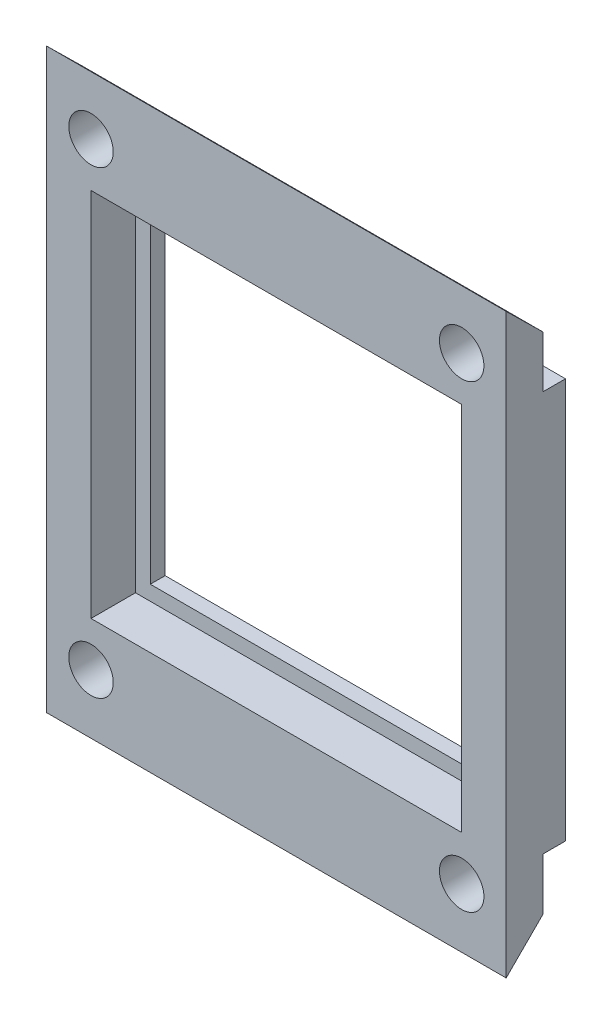
ISO-10303-21;
HEADER;
FILE_DESCRIPTION(('STEP AP214'),'2;1');
FILE_NAME('part.step','',(''),(''),'','','');
FILE_SCHEMA(('AUTOMOTIVE_DESIGN { 1 0 10303 214 1 1 1 1 }'));
ENDSEC;
DATA;
#1=APPLICATION_CONTEXT('core data for automotive mechanical design processes');
#2=APPLICATION_PROTOCOL_DEFINITION('international standard','automotive_design',2000,#1);
#3=PRODUCT_CONTEXT('',#1,'mechanical');
#4=PRODUCT('Part','Part','',(#3));
#5=PRODUCT_RELATED_PRODUCT_CATEGORY('part','',(#4));
#6=PRODUCT_DEFINITION_FORMATION('','',#4);
#7=PRODUCT_DEFINITION_CONTEXT('part definition',#1,'design');
#8=PRODUCT_DEFINITION('design','',#6,#7);
#9=PRODUCT_DEFINITION_SHAPE('','',#8);
#10=(LENGTH_UNIT() NAMED_UNIT(*) SI_UNIT(.MILLI.,.METRE.));
#11=(NAMED_UNIT(*) PLANE_ANGLE_UNIT() SI_UNIT($,.RADIAN.));
#12=(NAMED_UNIT(*) SI_UNIT($,.STERADIAN.) SOLID_ANGLE_UNIT());
#13=UNCERTAINTY_MEASURE_WITH_UNIT(LENGTH_MEASURE(1.E-05),#10,'distance_accuracy_value','');
#14=(GEOMETRIC_REPRESENTATION_CONTEXT(3) GLOBAL_UNCERTAINTY_ASSIGNED_CONTEXT((#13)) GLOBAL_UNIT_ASSIGNED_CONTEXT((#10,
#11,#12)) REPRESENTATION_CONTEXT('',''));
#15=CARTESIAN_POINT('',(0.,0.,0.));
#16=DIRECTION('',(0.,0.,1.));
#17=DIRECTION('',(1.,0.,0.));
#18=AXIS2_PLACEMENT_3D('',#15,#16,#17);
#19=CARTESIAN_POINT('',(15.5,15.5,0.));
#20=DIRECTION('',(0.,0.712755150375511,-0.701412928033966));
#21=DIRECTION('',(0.,0.701412928033966,0.712755150375511));
#22=AXIS2_PLACEMENT_3D('',#19,#20,#21);
#23=PLANE('',#22);
#24=DIRECTION('',(0.,-0.701412928033966,-0.712755150375511));
#25=VECTOR('',#24,1.);
#26=CARTESIAN_POINT('',(15.5,15.5,0.));
#27=LINE('',#26,#25);
#28=CARTESIAN_POINT('',(15.5,19.4363471602523,4.));
#29=VERTEX_POINT('',#28);
#30=CARTESIAN_POINT('',(15.5,17.,1.52425580258409));
#31=VERTEX_POINT('',#30);
#32=EDGE_CURVE('E242',#29,#31,#27,.T.);
#33=ORIENTED_EDGE('',*,*,#32,.T.);
#34=DIRECTION('',(-1.,0.,0.));
#35=VECTOR('',#34,1.);
#36=CARTESIAN_POINT('',(15.5,17.,1.52425580258409));
#37=LINE('',#36,#35);
#38=CARTESIAN_POINT('',(12.5,17.,1.52425580258409));
#39=VERTEX_POINT('',#38);
#40=EDGE_CURVE('E218',#31,#39,#37,.T.);
#41=ORIENTED_EDGE('',*,*,#40,.T.);
#42=CARTESIAN_POINT('',(-12.5,17.,1.52425580258409));
#43=VERTEX_POINT('',#42);
#44=EDGE_CURVE('E221',#39,#43,#37,.T.);
#45=ORIENTED_EDGE('',*,*,#44,.T.);
#46=CARTESIAN_POINT('',(-15.5,17.,1.52425580258409));
#47=VERTEX_POINT('',#46);
#48=EDGE_CURVE('E222',#43,#47,#37,.T.);
#49=ORIENTED_EDGE('',*,*,#48,.T.);
#50=DIRECTION('',(0.,-0.701412928033966,-0.712755150375511));
#51=VECTOR('',#50,1.);
#52=CARTESIAN_POINT('',(-15.5,15.5,0.));
#53=LINE('',#52,#51);
#54=CARTESIAN_POINT('',(-15.5,19.4363471602523,4.));
#55=VERTEX_POINT('',#54);
#56=EDGE_CURVE('E246',#55,#47,#53,.T.);
#57=ORIENTED_EDGE('',*,*,#56,.F.);
#58=DIRECTION('',(-1.,0.,0.));
#59=VECTOR('',#58,1.);
#60=CARTESIAN_POINT('',(15.5,19.4363471602523,4.));
#61=LINE('',#60,#59);
#62=EDGE_CURVE('E245',#29,#55,#61,.T.);
#63=ORIENTED_EDGE('',*,*,#62,.F.);
#64=EDGE_LOOP('',(#33,#41,#45,#49,#57,#63));
#65=FACE_BOUND('',#64,.T.);
#66=ADVANCED_FACE('F42',(#65),#23,.T.);
#67=CARTESIAN_POINT('',(15.5,-15.5,4.));
#68=DIRECTION('',(-1.,0.,0.));
#69=DIRECTION('',(0.,0.,1.));
#70=AXIS2_PLACEMENT_3D('',#67,#68,#69);
#71=PLANE('',#70);
#72=DIRECTION('',(0.,-0.707106781186549,0.707106781186546));
#73=VECTOR('',#72,1.);
#74=CARTESIAN_POINT('',(15.5,-19.5,4.));
#75=LINE('',#74,#73);
#76=CARTESIAN_POINT('',(15.5,-17.,1.5));
#77=VERTEX_POINT('',#76);
#78=CARTESIAN_POINT('',(15.5,-19.5,4.));
#79=VERTEX_POINT('',#78);
#80=EDGE_CURVE('E193',#77,#79,#75,.T.);
#81=ORIENTED_EDGE('',*,*,#80,.F.);
#82=DIRECTION('',(0.,1.,0.));
#83=VECTOR('',#82,1.);
#84=CARTESIAN_POINT('',(15.5,0.,1.5));
#85=LINE('',#84,#83);
#86=CARTESIAN_POINT('',(15.5,-13.5,1.5));
#87=VERTEX_POINT('',#86);
#88=EDGE_CURVE('E177',#77,#87,#85,.T.);
#89=ORIENTED_EDGE('',*,*,#88,.T.);
#90=DIRECTION('',(0.,0.,-1.));
#91=VECTOR('',#90,1.);
#92=CARTESIAN_POINT('',(15.5,-13.5,0.));
#93=LINE('',#92,#91);
#94=CARTESIAN_POINT('',(15.5,-13.5,0.));
#95=VERTEX_POINT('',#94);
#96=EDGE_CURVE('E183',#87,#95,#93,.T.);
#97=ORIENTED_EDGE('',*,*,#96,.T.);
#98=DIRECTION('',(0.,1.,0.));
#99=VECTOR('',#98,1.);
#100=CARTESIAN_POINT('',(15.5,-15.5,0.));
#101=LINE('',#100,#99);
#102=CARTESIAN_POINT('',(15.5,13.5,0.));
#103=VERTEX_POINT('',#102);
#104=EDGE_CURVE('E309',#95,#103,#101,.T.);
#105=ORIENTED_EDGE('',*,*,#104,.T.);
#106=DIRECTION('',(0.,0.,-1.));
#107=VECTOR('',#106,1.);
#108=CARTESIAN_POINT('',(15.5,13.5,0.));
#109=LINE('',#108,#107);
#110=CARTESIAN_POINT('',(15.5,13.5,1.52425580258409));
#111=VERTEX_POINT('',#110);
#112=EDGE_CURVE('E57',#111,#103,#109,.T.);
#113=ORIENTED_EDGE('',*,*,#112,.F.);
#114=DIRECTION('',(0.,-1.,0.));
#115=VECTOR('',#114,1.);
#116=CARTESIAN_POINT('',(15.5,0.,1.52425580258409));
#117=LINE('',#116,#115);
#118=EDGE_CURVE('E208',#31,#111,#117,.T.);
#119=ORIENTED_EDGE('',*,*,#118,.F.);
#120=ORIENTED_EDGE('',*,*,#32,.F.);
#121=DIRECTION('',(0.,1.,0.));
#122=VECTOR('',#121,1.);
#123=CARTESIAN_POINT('',(15.5,-15.5,4.));
#124=LINE('',#123,#122);
#125=EDGE_CURVE('E317',#79,#29,#124,.T.);
#126=ORIENTED_EDGE('',*,*,#125,.F.);
#127=EDGE_LOOP('',(#81,#89,#97,#105,#113,#119,#120,#126));
#128=FACE_BOUND('',#127,.T.);
#129=ADVANCED_FACE('F44',(#128),#71,.F.);
#130=CARTESIAN_POINT('',(-15.5,-15.5,4.));
#131=DIRECTION('',(1.,0.,0.));
#132=DIRECTION('',(0.,0.,-1.));
#133=AXIS2_PLACEMENT_3D('',#130,#131,#132);
#134=PLANE('',#133);
#135=DIRECTION('',(0.,0.,-1.));
#136=VECTOR('',#135,1.);
#137=CARTESIAN_POINT('',(-15.5,-13.5,0.));
#138=LINE('',#137,#136);
#139=CARTESIAN_POINT('',(-15.5,-13.5,1.5));
#140=VERTEX_POINT('',#139);
#141=CARTESIAN_POINT('',(-15.5,-13.5,0.));
#142=VERTEX_POINT('',#141);
#143=EDGE_CURVE('E67',#140,#142,#138,.T.);
#144=ORIENTED_EDGE('',*,*,#143,.F.);
#145=DIRECTION('',(0.,1.,0.));
#146=VECTOR('',#145,1.);
#147=CARTESIAN_POINT('',(-15.5,0.,1.5));
#148=LINE('',#147,#146);
#149=CARTESIAN_POINT('',(-15.5,-17.,1.5));
#150=VERTEX_POINT('',#149);
#151=EDGE_CURVE('E180',#150,#140,#148,.T.);
#152=ORIENTED_EDGE('',*,*,#151,.F.);
#153=DIRECTION('',(0.,-0.707106781186549,0.707106781186546));
#154=VECTOR('',#153,1.);
#155=CARTESIAN_POINT('',(-15.5,-19.5,4.));
#156=LINE('',#155,#154);
#157=CARTESIAN_POINT('',(-15.5,-19.5,4.));
#158=VERTEX_POINT('',#157);
#159=EDGE_CURVE('E249',#150,#158,#156,.T.);
#160=ORIENTED_EDGE('',*,*,#159,.T.);
#161=DIRECTION('',(0.,-1.,0.));
#162=VECTOR('',#161,1.);
#163=CARTESIAN_POINT('',(-15.5,-15.5,4.));
#164=LINE('',#163,#162);
#165=EDGE_CURVE('E319',#55,#158,#164,.T.);
#166=ORIENTED_EDGE('',*,*,#165,.F.);
#167=ORIENTED_EDGE('',*,*,#56,.T.);
#168=DIRECTION('',(0.,-1.,0.));
#169=VECTOR('',#168,1.);
#170=CARTESIAN_POINT('',(-15.5,0.,1.52425580258409));
#171=LINE('',#170,#169);
#172=CARTESIAN_POINT('',(-15.5,13.5,1.52425580258409));
#173=VERTEX_POINT('',#172);
#174=EDGE_CURVE('E209',#47,#173,#171,.T.);
#175=ORIENTED_EDGE('',*,*,#174,.T.);
#176=DIRECTION('',(0.,0.,-1.));
#177=VECTOR('',#176,1.);
#178=CARTESIAN_POINT('',(-15.5,13.5,0.));
#179=LINE('',#178,#177);
#180=CARTESIAN_POINT('',(-15.5,13.5,0.));
#181=VERTEX_POINT('',#180);
#182=EDGE_CURVE('E212',#173,#181,#179,.T.);
#183=ORIENTED_EDGE('',*,*,#182,.T.);
#184=DIRECTION('',(0.,-1.,0.));
#185=VECTOR('',#184,1.);
#186=CARTESIAN_POINT('',(-15.5,-15.5,0.));
#187=LINE('',#186,#185);
#188=EDGE_CURVE('E320',#181,#142,#187,.T.);
#189=ORIENTED_EDGE('',*,*,#188,.T.);
#190=EDGE_LOOP('',(#144,#152,#160,#166,#167,#175,#183,#189));
#191=FACE_BOUND('',#190,.T.);
#192=ADVANCED_FACE('F350',(#191),#134,.F.);
#193=CARTESIAN_POINT('',(0.,0.,0.));
#194=DIRECTION('',(0.,0.,-1.));
#195=DIRECTION('',(-1.,0.,0.));
#196=AXIS2_PLACEMENT_3D('',#193,#194,#195);
#197=PLANE('',#196);
#198=DIRECTION('',(-1.,0.,0.));
#199=VECTOR('',#198,1.);
#200=CARTESIAN_POINT('',(15.5,-13.5,0.));
#201=LINE('',#200,#199);
#202=EDGE_CURVE('E182',#95,#142,#201,.T.);
#203=ORIENTED_EDGE('',*,*,#202,.T.);
#204=ORIENTED_EDGE('',*,*,#188,.F.);
#205=DIRECTION('',(-1.,0.,0.));
#206=VECTOR('',#205,1.);
#207=CARTESIAN_POINT('',(15.5,13.5,0.));
#208=LINE('',#207,#206);
#209=EDGE_CURVE('E198',#103,#181,#208,.T.);
#210=ORIENTED_EDGE('',*,*,#209,.F.);
#211=ORIENTED_EDGE('',*,*,#104,.F.);
#212=EDGE_LOOP('',(#203,#204,#210,#211));
#213=FACE_BOUND('',#212,.T.);
#214=DIRECTION('',(0.,-1.,0.));
#215=VECTOR('',#214,1.);
#216=CARTESIAN_POINT('',(11.5,0.,0.));
#217=LINE('',#216,#215);
#218=CARTESIAN_POINT('',(11.5,11.5,0.));
#219=VERTEX_POINT('',#218);
#220=CARTESIAN_POINT('',(11.5,-11.5,0.));
#221=VERTEX_POINT('',#220);
#222=EDGE_CURVE('E336',#219,#221,#217,.T.);
#223=ORIENTED_EDGE('',*,*,#222,.F.);
#224=DIRECTION('',(1.,0.,0.));
#225=VECTOR('',#224,1.);
#226=CARTESIAN_POINT('',(0.,11.5,0.));
#227=LINE('',#226,#225);
#228=CARTESIAN_POINT('',(-11.5,11.5,0.));
#229=VERTEX_POINT('',#228);
#230=EDGE_CURVE('E323',#229,#219,#227,.T.);
#231=ORIENTED_EDGE('',*,*,#230,.F.);
#232=DIRECTION('',(0.,1.,0.));
#233=VECTOR('',#232,1.);
#234=CARTESIAN_POINT('',(-11.5,0.,0.));
#235=LINE('',#234,#233);
#236=CARTESIAN_POINT('',(-11.5,-11.5,0.));
#237=VERTEX_POINT('',#236);
#238=EDGE_CURVE('E329',#237,#229,#235,.T.);
#239=ORIENTED_EDGE('',*,*,#238,.F.);
#240=DIRECTION('',(-1.,0.,0.));
#241=VECTOR('',#240,1.);
#242=CARTESIAN_POINT('',(0.,-11.5,0.));
#243=LINE('',#242,#241);
#244=EDGE_CURVE('E333',#221,#237,#243,.T.);
#245=ORIENTED_EDGE('',*,*,#244,.F.);
#246=EDGE_LOOP('',(#223,#231,#239,#245));
#247=FACE_BOUND('',#246,.T.);
#248=ADVANCED_FACE('F376',(#213,#247),#197,.T.);
#249=CARTESIAN_POINT('',(12.5,15.5,10.));
#250=DIRECTION('',(0.,0.,-1.));
#251=DIRECTION('',(-1.,0.,0.));
#252=AXIS2_PLACEMENT_3D('',#249,#250,#251);
#253=CYLINDRICAL_SURFACE('',#252,1.5);
#254=CARTESIAN_POINT('',(12.5,15.5,4.));
#255=DIRECTION('',(0.,0.,-1.));
#256=DIRECTION('',(-1.,0.,0.));
#257=AXIS2_PLACEMENT_3D('',#254,#255,#256);
#258=CIRCLE('',#257,1.5);
#259=CARTESIAN_POINT('',(11.,15.5,4.));
#260=VERTEX_POINT('',#259);
#261=EDGE_CURVE('E239',#260,#260,#258,.T.);
#262=ORIENTED_EDGE('',*,*,#261,.F.);
#263=EDGE_LOOP('',(#262));
#264=FACE_BOUND('',#263,.T.);
#265=CARTESIAN_POINT('',(12.5,15.5,1.52425580258409));
#266=DIRECTION('',(0.,0.,-1.));
#267=DIRECTION('',(0.,1.,0.));
#268=AXIS2_PLACEMENT_3D('',#265,#266,#267);
#269=CIRCLE('',#268,1.5);
#270=EDGE_CURVE('E227',#39,#39,#269,.F.);
#271=ORIENTED_EDGE('',*,*,#270,.F.);
#272=EDGE_LOOP('',(#271));
#273=FACE_BOUND('',#272,.T.);
#274=ADVANCED_FACE('F367',(#264,#273),#253,.F.);
#275=CARTESIAN_POINT('',(-12.5,15.5,10.));
#276=DIRECTION('',(0.,0.,-1.));
#277=DIRECTION('',(-1.,0.,0.));
#278=AXIS2_PLACEMENT_3D('',#275,#276,#277);
#279=CYLINDRICAL_SURFACE('',#278,1.5);
#280=CARTESIAN_POINT('',(-12.5,15.5,4.));
#281=DIRECTION('',(0.,0.,-1.));
#282=DIRECTION('',(-1.,0.,0.));
#283=AXIS2_PLACEMENT_3D('',#280,#281,#282);
#284=CIRCLE('',#283,1.5);
#285=CARTESIAN_POINT('',(-14.,15.5,4.));
#286=VERTEX_POINT('',#285);
#287=EDGE_CURVE('E236',#286,#286,#284,.F.);
#288=ORIENTED_EDGE('',*,*,#287,.T.);
#289=EDGE_LOOP('',(#288));
#290=FACE_BOUND('',#289,.T.);
#291=CARTESIAN_POINT('',(-12.5,15.5,1.52425580258409));
#292=DIRECTION('',(0.,0.,-1.));
#293=DIRECTION('',(0.,1.,0.));
#294=AXIS2_PLACEMENT_3D('',#291,#292,#293);
#295=CIRCLE('',#294,1.5);
#296=EDGE_CURVE('E11',#43,#43,#295,.T.);
#297=ORIENTED_EDGE('',*,*,#296,.T.);
#298=EDGE_LOOP('',(#297));
#299=FACE_BOUND('',#298,.T.);
#300=ADVANCED_FACE('F365',(#290,#299),#279,.F.);
#301=CARTESIAN_POINT('',(-15.5,-19.5,4.));
#302=DIRECTION('',(0.,0.707106781186546,0.707106781186549));
#303=DIRECTION('',(0.,-0.707106781186549,0.707106781186546));
#304=AXIS2_PLACEMENT_3D('',#301,#302,#303);
#305=PLANE('',#304);
#306=ORIENTED_EDGE('',*,*,#159,.F.);
#307=DIRECTION('',(-1.,0.,0.));
#308=VECTOR('',#307,1.);
#309=CARTESIAN_POINT('',(15.5,-17.,1.5));
#310=LINE('',#309,#308);
#311=CARTESIAN_POINT('',(-12.5,-17.,1.49999999999999));
#312=VERTEX_POINT('',#311);
#313=EDGE_CURVE('E204',#312,#150,#310,.T.);
#314=ORIENTED_EDGE('',*,*,#313,.F.);
#315=CARTESIAN_POINT('',(12.5,-17.,1.49999999999999));
#316=VERTEX_POINT('',#315);
#317=EDGE_CURVE('E203',#316,#312,#310,.T.);
#318=ORIENTED_EDGE('',*,*,#317,.F.);
#319=EDGE_CURVE('E200',#77,#316,#310,.T.);
#320=ORIENTED_EDGE('',*,*,#319,.F.);
#321=ORIENTED_EDGE('',*,*,#80,.T.);
#322=DIRECTION('',(1.,0.,0.));
#323=VECTOR('',#322,1.);
#324=CARTESIAN_POINT('',(-15.5,-19.5,4.));
#325=LINE('',#324,#323);
#326=EDGE_CURVE('E252',#158,#79,#325,.T.);
#327=ORIENTED_EDGE('',*,*,#326,.F.);
#328=EDGE_LOOP('',(#306,#314,#318,#320,#321,#327));
#329=FACE_BOUND('',#328,.T.);
#330=ADVANCED_FACE('F346',(#329),#305,.F.);
#331=CARTESIAN_POINT('',(0.,0.,1.));
#332=DIRECTION('',(0.,0.,-1.));
#333=DIRECTION('',(-1.,0.,0.));
#334=AXIS2_PLACEMENT_3D('',#331,#332,#333);
#335=PLANE('',#334);
#336=DIRECTION('',(0.,1.,0.));
#337=VECTOR('',#336,1.);
#338=CARTESIAN_POINT('',(12.5,-12.5,1.));
#339=LINE('',#338,#337);
#340=CARTESIAN_POINT('',(12.5,-12.5,1.));
#341=VERTEX_POINT('',#340);
#342=CARTESIAN_POINT('',(12.5,12.5,1.));
#343=VERTEX_POINT('',#342);
#344=EDGE_CURVE('E281',#341,#343,#339,.T.);
#345=ORIENTED_EDGE('',*,*,#344,.T.);
#346=DIRECTION('',(-1.,0.,0.));
#347=VECTOR('',#346,1.);
#348=CARTESIAN_POINT('',(-12.5,12.5,1.));
#349=LINE('',#348,#347);
#350=CARTESIAN_POINT('',(-12.5,12.5,1.));
#351=VERTEX_POINT('',#350);
#352=EDGE_CURVE('E284',#343,#351,#349,.T.);
#353=ORIENTED_EDGE('',*,*,#352,.T.);
#354=DIRECTION('',(0.,-1.,0.));
#355=VECTOR('',#354,1.);
#356=CARTESIAN_POINT('',(-12.5,-12.5,1.));
#357=LINE('',#356,#355);
#358=CARTESIAN_POINT('',(-12.5,-12.5,1.));
#359=VERTEX_POINT('',#358);
#360=EDGE_CURVE('E288',#351,#359,#357,.T.);
#361=ORIENTED_EDGE('',*,*,#360,.T.);
#362=DIRECTION('',(1.,0.,0.));
#363=VECTOR('',#362,1.);
#364=CARTESIAN_POINT('',(-12.5,-12.5,1.));
#365=LINE('',#364,#363);
#366=EDGE_CURVE('E292',#359,#341,#365,.T.);
#367=ORIENTED_EDGE('',*,*,#366,.T.);
#368=EDGE_LOOP('',(#345,#353,#361,#367));
#369=FACE_BOUND('',#368,.T.);
#370=DIRECTION('',(0.,1.,0.));
#371=VECTOR('',#370,1.);
#372=CARTESIAN_POINT('',(11.5,-11.5,1.));
#373=LINE('',#372,#371);
#374=CARTESIAN_POINT('',(11.5,-11.5,1.));
#375=VERTEX_POINT('',#374);
#376=CARTESIAN_POINT('',(11.5,11.5,1.));
#377=VERTEX_POINT('',#376);
#378=EDGE_CURVE('E257',#375,#377,#373,.T.);
#379=ORIENTED_EDGE('',*,*,#378,.F.);
#380=DIRECTION('',(1.,0.,0.));
#381=VECTOR('',#380,1.);
#382=CARTESIAN_POINT('',(-11.5,-11.5,1.));
#383=LINE('',#382,#381);
#384=CARTESIAN_POINT('',(-11.5,-11.5,1.));
#385=VERTEX_POINT('',#384);
#386=EDGE_CURVE('E266',#385,#375,#383,.T.);
#387=ORIENTED_EDGE('',*,*,#386,.F.);
#388=DIRECTION('',(0.,-1.,0.));
#389=VECTOR('',#388,1.);
#390=CARTESIAN_POINT('',(-11.5,-11.5,1.));
#391=LINE('',#390,#389);
#392=CARTESIAN_POINT('',(-11.5,11.5,1.));
#393=VERTEX_POINT('',#392);
#394=EDGE_CURVE('E263',#393,#385,#391,.T.);
#395=ORIENTED_EDGE('',*,*,#394,.F.);
#396=DIRECTION('',(-1.,0.,0.));
#397=VECTOR('',#396,1.);
#398=CARTESIAN_POINT('',(-11.5,11.5,1.));
#399=LINE('',#398,#397);
#400=EDGE_CURVE('E260',#377,#393,#399,.T.);
#401=ORIENTED_EDGE('',*,*,#400,.F.);
#402=EDGE_LOOP('',(#379,#387,#395,#401));
#403=FACE_BOUND('',#402,.T.);
#404=ADVANCED_FACE('F374',(#369,#403),#335,.F.);
#405=CARTESIAN_POINT('',(0.,0.,4.));
#406=DIRECTION('',(0.,0.,-1.));
#407=DIRECTION('',(-1.,0.,0.));
#408=AXIS2_PLACEMENT_3D('',#405,#406,#407);
#409=PLANE('',#408);
#410=CARTESIAN_POINT('',(12.5,-15.5,4.));
#411=DIRECTION('',(0.,0.,-1.));
#412=DIRECTION('',(-1.,0.,0.));
#413=AXIS2_PLACEMENT_3D('',#410,#411,#412);
#414=CIRCLE('',#413,1.5);
#415=CARTESIAN_POINT('',(11.,-15.5,4.));
#416=VERTEX_POINT('',#415);
#417=EDGE_CURVE('E229',#416,#416,#414,.F.);
#418=ORIENTED_EDGE('',*,*,#417,.F.);
#419=EDGE_LOOP('',(#418));
#420=FACE_BOUND('',#419,.T.);
#421=CARTESIAN_POINT('',(-12.5,-15.5,4.));
#422=DIRECTION('',(0.,0.,-1.));
#423=DIRECTION('',(-1.,0.,0.));
#424=AXIS2_PLACEMENT_3D('',#421,#422,#423);
#425=CIRCLE('',#424,1.5);
#426=CARTESIAN_POINT('',(-14.,-15.5,4.));
#427=VERTEX_POINT('',#426);
#428=EDGE_CURVE('E232',#427,#427,#425,.T.);
#429=ORIENTED_EDGE('',*,*,#428,.T.);
#430=EDGE_LOOP('',(#429));
#431=FACE_BOUND('',#430,.T.);
#432=ORIENTED_EDGE('',*,*,#287,.F.);
#433=EDGE_LOOP('',(#432));
#434=FACE_BOUND('',#433,.T.);
#435=ORIENTED_EDGE('',*,*,#261,.T.);
#436=EDGE_LOOP('',(#435));
#437=FACE_BOUND('',#436,.T.);
#438=DIRECTION('',(-1.,0.,0.));
#439=VECTOR('',#438,1.);
#440=CARTESIAN_POINT('',(-12.5,12.5,4.));
#441=LINE('',#440,#439);
#442=CARTESIAN_POINT('',(12.5,12.5,4.));
#443=VERTEX_POINT('',#442);
#444=CARTESIAN_POINT('',(-12.5,12.5,4.));
#445=VERTEX_POINT('',#444);
#446=EDGE_CURVE('E298',#443,#445,#441,.T.);
#447=ORIENTED_EDGE('',*,*,#446,.F.);
#448=DIRECTION('',(0.,1.,0.));
#449=VECTOR('',#448,1.);
#450=CARTESIAN_POINT('',(12.5,-12.5,4.));
#451=LINE('',#450,#449);
#452=CARTESIAN_POINT('',(12.5,-12.5,4.));
#453=VERTEX_POINT('',#452);
#454=EDGE_CURVE('E273',#453,#443,#451,.T.);
#455=ORIENTED_EDGE('',*,*,#454,.F.);
#456=DIRECTION('',(1.,0.,0.));
#457=VECTOR('',#456,1.);
#458=CARTESIAN_POINT('',(-12.5,-12.5,4.));
#459=LINE('',#458,#457);
#460=CARTESIAN_POINT('',(-12.5,-12.5,4.));
#461=VERTEX_POINT('',#460);
#462=EDGE_CURVE('E285',#461,#453,#459,.T.);
#463=ORIENTED_EDGE('',*,*,#462,.F.);
#464=DIRECTION('',(0.,-1.,0.));
#465=VECTOR('',#464,1.);
#466=CARTESIAN_POINT('',(-12.5,-12.5,4.));
#467=LINE('',#466,#465);
#468=EDGE_CURVE('E301',#445,#461,#467,.T.);
#469=ORIENTED_EDGE('',*,*,#468,.F.);
#470=EDGE_LOOP('',(#447,#455,#463,#469));
#471=FACE_BOUND('',#470,.T.);
#472=ORIENTED_EDGE('',*,*,#125,.T.);
#473=ORIENTED_EDGE('',*,*,#62,.T.);
#474=ORIENTED_EDGE('',*,*,#165,.T.);
#475=ORIENTED_EDGE('',*,*,#326,.T.);
#476=EDGE_LOOP('',(#472,#473,#474,#475));
#477=FACE_BOUND('',#476,.T.);
#478=ADVANCED_FACE('F353',(#420,#431,#434,#437,#471,#477),#409,.F.);
#479=CARTESIAN_POINT('',(12.5,-12.5,1.));
#480=DIRECTION('',(1.,0.,0.));
#481=DIRECTION('',(0.,0.,-1.));
#482=AXIS2_PLACEMENT_3D('',#479,#480,#481);
#483=PLANE('',#482);
#484=ORIENTED_EDGE('',*,*,#454,.T.);
#485=DIRECTION('',(0.,0.,1.));
#486=VECTOR('',#485,1.);
#487=CARTESIAN_POINT('',(12.5,12.5,1.));
#488=LINE('',#487,#486);
#489=EDGE_CURVE('E296',#343,#443,#488,.T.);
#490=ORIENTED_EDGE('',*,*,#489,.F.);
#491=ORIENTED_EDGE('',*,*,#344,.F.);
#492=DIRECTION('',(0.,0.,1.));
#493=VECTOR('',#492,1.);
#494=CARTESIAN_POINT('',(12.5,-12.5,1.));
#495=LINE('',#494,#493);
#496=EDGE_CURVE('E307',#341,#453,#495,.T.);
#497=ORIENTED_EDGE('',*,*,#496,.T.);
#498=EDGE_LOOP('',(#484,#490,#491,#497));
#499=FACE_BOUND('',#498,.T.);
#500=ADVANCED_FACE('F411',(#499),#483,.F.);
#501=CARTESIAN_POINT('',(-12.5,-12.5,1.));
#502=DIRECTION('',(0.,-1.,0.));
#503=DIRECTION('',(0.,0.,-1.));
#504=AXIS2_PLACEMENT_3D('',#501,#502,#503);
#505=PLANE('',#504);
#506=ORIENTED_EDGE('',*,*,#462,.T.);
#507=ORIENTED_EDGE('',*,*,#496,.F.);
#508=ORIENTED_EDGE('',*,*,#366,.F.);
#509=DIRECTION('',(0.,0.,1.));
#510=VECTOR('',#509,1.);
#511=CARTESIAN_POINT('',(-12.5,-12.5,1.));
#512=LINE('',#511,#510);
#513=EDGE_CURVE('E310',#359,#461,#512,.T.);
#514=ORIENTED_EDGE('',*,*,#513,.T.);
#515=EDGE_LOOP('',(#506,#507,#508,#514));
#516=FACE_BOUND('',#515,.T.);
#517=ADVANCED_FACE('F407',(#516),#505,.F.);
#518=CARTESIAN_POINT('',(-12.5,-12.5,1.));
#519=DIRECTION('',(-1.,0.,0.));
#520=DIRECTION('',(0.,0.,1.));
#521=AXIS2_PLACEMENT_3D('',#518,#519,#520);
#522=PLANE('',#521);
#523=ORIENTED_EDGE('',*,*,#468,.T.);
#524=ORIENTED_EDGE('',*,*,#513,.F.);
#525=ORIENTED_EDGE('',*,*,#360,.F.);
#526=DIRECTION('',(0.,0.,1.));
#527=VECTOR('',#526,1.);
#528=CARTESIAN_POINT('',(-12.5,12.5,1.));
#529=LINE('',#528,#527);
#530=EDGE_CURVE('E313',#351,#445,#529,.T.);
#531=ORIENTED_EDGE('',*,*,#530,.T.);
#532=EDGE_LOOP('',(#523,#524,#525,#531));
#533=FACE_BOUND('',#532,.T.);
#534=ADVANCED_FACE('F410',(#533),#522,.F.);
#535=CARTESIAN_POINT('',(-12.5,12.5,1.));
#536=DIRECTION('',(0.,1.,0.));
#537=DIRECTION('',(0.,0.,1.));
#538=AXIS2_PLACEMENT_3D('',#535,#536,#537);
#539=PLANE('',#538);
#540=ORIENTED_EDGE('',*,*,#446,.T.);
#541=ORIENTED_EDGE('',*,*,#530,.F.);
#542=ORIENTED_EDGE('',*,*,#352,.F.);
#543=ORIENTED_EDGE('',*,*,#489,.T.);
#544=EDGE_LOOP('',(#540,#541,#542,#543));
#545=FACE_BOUND('',#544,.T.);
#546=ADVANCED_FACE('F402',(#545),#539,.F.);
#547=CARTESIAN_POINT('',(11.5,-11.5,-4.));
#548=DIRECTION('',(1.,0.,0.));
#549=DIRECTION('',(0.,0.,-1.));
#550=AXIS2_PLACEMENT_3D('',#547,#548,#549);
#551=PLANE('',#550);
#552=ORIENTED_EDGE('',*,*,#222,.T.);
#553=DIRECTION('',(0.,0.,1.));
#554=VECTOR('',#553,1.);
#555=CARTESIAN_POINT('',(11.5,-11.5,-4.));
#556=LINE('',#555,#554);
#557=EDGE_CURVE('E271',#221,#375,#556,.T.);
#558=ORIENTED_EDGE('',*,*,#557,.T.);
#559=ORIENTED_EDGE('',*,*,#378,.T.);
#560=DIRECTION('',(0.,0.,1.));
#561=VECTOR('',#560,1.);
#562=CARTESIAN_POINT('',(11.5,11.5,-4.));
#563=LINE('',#562,#561);
#564=EDGE_CURVE('E270',#219,#377,#563,.T.);
#565=ORIENTED_EDGE('',*,*,#564,.F.);
#566=EDGE_LOOP('',(#552,#558,#559,#565));
#567=FACE_BOUND('',#566,.T.);
#568=ADVANCED_FACE('F390',(#567),#551,.F.);
#569=CARTESIAN_POINT('',(-11.5,-11.5,-4.));
#570=DIRECTION('',(0.,-1.,0.));
#571=DIRECTION('',(0.,0.,-1.));
#572=AXIS2_PLACEMENT_3D('',#569,#570,#571);
#573=PLANE('',#572);
#574=ORIENTED_EDGE('',*,*,#244,.T.);
#575=DIRECTION('',(0.,0.,1.));
#576=VECTOR('',#575,1.);
#577=CARTESIAN_POINT('',(-11.5,-11.5,-4.));
#578=LINE('',#577,#576);
#579=EDGE_CURVE('E274',#237,#385,#578,.T.);
#580=ORIENTED_EDGE('',*,*,#579,.T.);
#581=ORIENTED_EDGE('',*,*,#386,.T.);
#582=ORIENTED_EDGE('',*,*,#557,.F.);
#583=EDGE_LOOP('',(#574,#580,#581,#582));
#584=FACE_BOUND('',#583,.T.);
#585=ADVANCED_FACE('F386',(#584),#573,.F.);
#586=CARTESIAN_POINT('',(-11.5,-11.5,-4.));
#587=DIRECTION('',(-1.,0.,0.));
#588=DIRECTION('',(0.,0.,1.));
#589=AXIS2_PLACEMENT_3D('',#586,#587,#588);
#590=PLANE('',#589);
#591=ORIENTED_EDGE('',*,*,#238,.T.);
#592=DIRECTION('',(0.,0.,1.));
#593=VECTOR('',#592,1.);
#594=CARTESIAN_POINT('',(-11.5,11.5,-4.));
#595=LINE('',#594,#593);
#596=EDGE_CURVE('E278',#229,#393,#595,.T.);
#597=ORIENTED_EDGE('',*,*,#596,.T.);
#598=ORIENTED_EDGE('',*,*,#394,.T.);
#599=ORIENTED_EDGE('',*,*,#579,.F.);
#600=EDGE_LOOP('',(#591,#597,#598,#599));
#601=FACE_BOUND('',#600,.T.);
#602=ADVANCED_FACE('F389',(#601),#590,.F.);
#603=CARTESIAN_POINT('',(-11.5,11.5,-4.));
#604=DIRECTION('',(0.,1.,0.));
#605=DIRECTION('',(0.,0.,1.));
#606=AXIS2_PLACEMENT_3D('',#603,#604,#605);
#607=PLANE('',#606);
#608=ORIENTED_EDGE('',*,*,#230,.T.);
#609=ORIENTED_EDGE('',*,*,#564,.T.);
#610=ORIENTED_EDGE('',*,*,#400,.T.);
#611=ORIENTED_EDGE('',*,*,#596,.F.);
#612=EDGE_LOOP('',(#608,#609,#610,#611));
#613=FACE_BOUND('',#612,.T.);
#614=ADVANCED_FACE('F394',(#613),#607,.F.);
#615=CARTESIAN_POINT('',(-12.5,-15.5,10.));
#616=DIRECTION('',(0.,0.,-1.));
#617=DIRECTION('',(-1.,0.,0.));
#618=AXIS2_PLACEMENT_3D('',#615,#616,#617);
#619=CYLINDRICAL_SURFACE('',#618,1.5);
#620=CARTESIAN_POINT('',(-12.5,-15.5,1.5));
#621=DIRECTION('',(0.,0.,1.));
#622=DIRECTION('',(1.,0.,0.));
#623=AXIS2_PLACEMENT_3D('',#620,#621,#622);
#624=CIRCLE('',#623,1.5);
#625=EDGE_CURVE('E202',#312,#312,#624,.F.);
#626=ORIENTED_EDGE('',*,*,#625,.T.);
#627=EDGE_LOOP('',(#626));
#628=FACE_BOUND('',#627,.T.);
#629=ORIENTED_EDGE('',*,*,#428,.F.);
#630=EDGE_LOOP('',(#629));
#631=FACE_BOUND('',#630,.T.);
#632=ADVANCED_FACE('F398',(#628,#631),#619,.F.);
#633=CARTESIAN_POINT('',(12.5,-15.5,10.));
#634=DIRECTION('',(0.,0.,-1.));
#635=DIRECTION('',(-1.,0.,0.));
#636=AXIS2_PLACEMENT_3D('',#633,#634,#635);
#637=CYLINDRICAL_SURFACE('',#636,1.5);
#638=CARTESIAN_POINT('',(12.5,-15.5,1.5));
#639=DIRECTION('',(0.,0.,1.));
#640=DIRECTION('',(1.,0.,0.));
#641=AXIS2_PLACEMENT_3D('',#638,#639,#640);
#642=CIRCLE('',#641,1.5);
#643=EDGE_CURVE('E50',#316,#316,#642,.T.);
#644=ORIENTED_EDGE('',*,*,#643,.F.);
#645=EDGE_LOOP('',(#644));
#646=FACE_BOUND('',#645,.T.);
#647=ORIENTED_EDGE('',*,*,#417,.T.);
#648=EDGE_LOOP('',(#647));
#649=FACE_BOUND('',#648,.T.);
#650=ADVANCED_FACE('F341',(#646,#649),#637,.F.);
#651=CARTESIAN_POINT('',(15.5,0.,1.5));
#652=DIRECTION('',(0.,0.,1.));
#653=DIRECTION('',(1.,0.,0.));
#654=AXIS2_PLACEMENT_3D('',#651,#652,#653);
#655=PLANE('',#654);
#656=ORIENTED_EDGE('',*,*,#313,.T.);
#657=ORIENTED_EDGE('',*,*,#151,.T.);
#658=DIRECTION('',(-1.,0.,0.));
#659=VECTOR('',#658,1.);
#660=CARTESIAN_POINT('',(15.5,-13.5,1.5));
#661=LINE('',#660,#659);
#662=EDGE_CURVE('E172',#87,#140,#661,.T.);
#663=ORIENTED_EDGE('',*,*,#662,.F.);
#664=ORIENTED_EDGE('',*,*,#88,.F.);
#665=ORIENTED_EDGE('',*,*,#319,.T.);
#666=ORIENTED_EDGE('',*,*,#643,.T.);
#667=ORIENTED_EDGE('',*,*,#317,.T.);
#668=ORIENTED_EDGE('',*,*,#625,.F.);
#669=EDGE_LOOP('',(#656,#657,#663,#664,#665,#666,#667,#668));
#670=FACE_BOUND('',#669,.T.);
#671=ADVANCED_FACE('F174',(#670),#655,.F.);
#672=CARTESIAN_POINT('',(15.5,-13.5,0.));
#673=DIRECTION('',(0.,1.,0.));
#674=DIRECTION('',(0.,0.,1.));
#675=AXIS2_PLACEMENT_3D('',#672,#673,#674);
#676=PLANE('',#675);
#677=ORIENTED_EDGE('',*,*,#143,.T.);
#678=ORIENTED_EDGE('',*,*,#202,.F.);
#679=ORIENTED_EDGE('',*,*,#96,.F.);
#680=ORIENTED_EDGE('',*,*,#662,.T.);
#681=EDGE_LOOP('',(#677,#678,#679,#680));
#682=FACE_BOUND('',#681,.T.);
#683=ADVANCED_FACE('F186',(#682),#676,.F.);
#684=CARTESIAN_POINT('',(15.5,0.,1.52425580258409));
#685=DIRECTION('',(0.,0.,-1.));
#686=DIRECTION('',(0.,1.,0.));
#687=AXIS2_PLACEMENT_3D('',#684,#685,#686);
#688=PLANE('',#687);
#689=ORIENTED_EDGE('',*,*,#40,.F.);
#690=ORIENTED_EDGE('',*,*,#118,.T.);
#691=DIRECTION('',(-1.,0.,0.));
#692=VECTOR('',#691,1.);
#693=CARTESIAN_POINT('',(15.5,13.5,1.52425580258409));
#694=LINE('',#693,#692);
#695=EDGE_CURVE('E211',#111,#173,#694,.T.);
#696=ORIENTED_EDGE('',*,*,#695,.T.);
#697=ORIENTED_EDGE('',*,*,#174,.F.);
#698=ORIENTED_EDGE('',*,*,#48,.F.);
#699=ORIENTED_EDGE('',*,*,#296,.F.);
#700=ORIENTED_EDGE('',*,*,#44,.F.);
#701=ORIENTED_EDGE('',*,*,#270,.T.);
#702=EDGE_LOOP('',(#689,#690,#696,#697,#698,#699,#700,#701));
#703=FACE_BOUND('',#702,.T.);
#704=ADVANCED_FACE('F363',(#703),#688,.T.);
#705=CARTESIAN_POINT('',(15.5,13.5,0.));
#706=DIRECTION('',(0.,1.,0.));
#707=DIRECTION('',(0.,0.,1.));
#708=AXIS2_PLACEMENT_3D('',#705,#706,#707);
#709=PLANE('',#708);
#710=ORIENTED_EDGE('',*,*,#182,.F.);
#711=ORIENTED_EDGE('',*,*,#695,.F.);
#712=ORIENTED_EDGE('',*,*,#112,.T.);
#713=ORIENTED_EDGE('',*,*,#209,.T.);
#714=EDGE_LOOP('',(#710,#711,#712,#713));
#715=FACE_BOUND('',#714,.T.);
#716=ADVANCED_FACE('F494',(#715),#709,.T.);
#717=CLOSED_SHELL('',(#66,#129,#192,#248,#274,#300,#330,#404,#478,#500,#517,#534,#546,#568,#585,
#602,#614,#632,#650,#671,#683,#704,#716));
#718=MANIFOLD_SOLID_BREP('B2',#717);
#719=ADVANCED_BREP_SHAPE_REPRESENTATION('',(#18,#718),#14);
#720=SHAPE_DEFINITION_REPRESENTATION(#9,#719);
ENDSEC;
END-ISO-10303-21;
